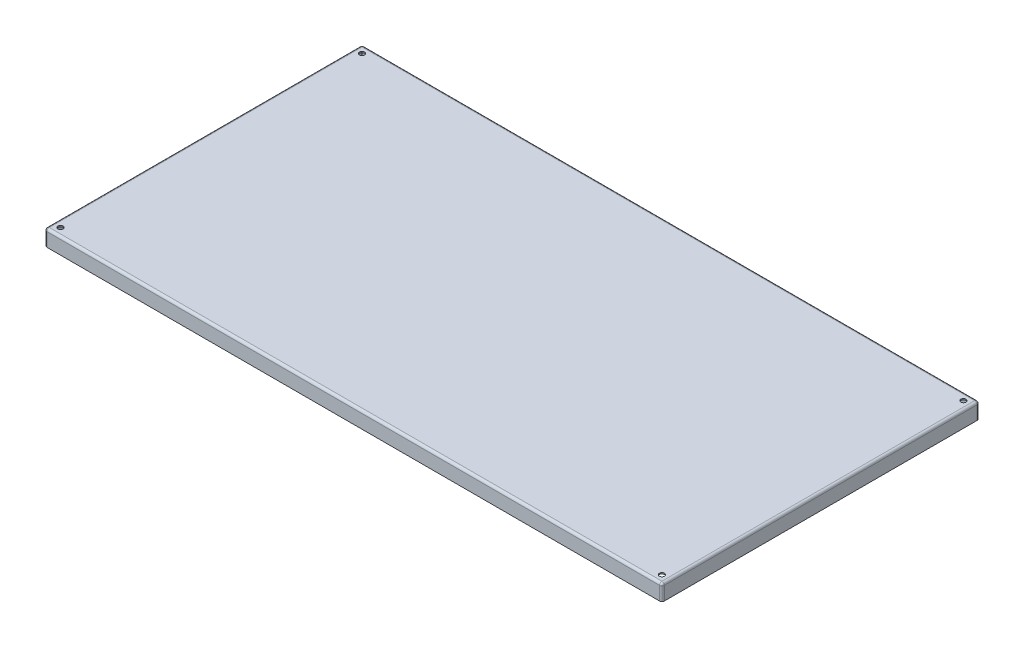
ISO-10303-21;
HEADER;
FILE_DESCRIPTION(('STEP AP214'),'2;1');
FILE_NAME('part.step','',(''),(''),'','','');
FILE_SCHEMA(('AUTOMOTIVE_DESIGN { 1 0 10303 214 1 1 1 1 }'));
ENDSEC;
DATA;
#1=APPLICATION_CONTEXT('core data for automotive mechanical design processes');
#2=APPLICATION_PROTOCOL_DEFINITION('international standard','automotive_design',2000,#1);
#3=PRODUCT_CONTEXT('',#1,'mechanical');
#4=PRODUCT('Part','Part','',(#3));
#5=PRODUCT_RELATED_PRODUCT_CATEGORY('part','',(#4));
#6=PRODUCT_DEFINITION_FORMATION('','',#4);
#7=PRODUCT_DEFINITION_CONTEXT('part definition',#1,'design');
#8=PRODUCT_DEFINITION('design','',#6,#7);
#9=PRODUCT_DEFINITION_SHAPE('','',#8);
#10=(LENGTH_UNIT() NAMED_UNIT(*) SI_UNIT(.MILLI.,.METRE.));
#11=(NAMED_UNIT(*) PLANE_ANGLE_UNIT() SI_UNIT($,.RADIAN.));
#12=(NAMED_UNIT(*) SI_UNIT($,.STERADIAN.) SOLID_ANGLE_UNIT());
#13=UNCERTAINTY_MEASURE_WITH_UNIT(LENGTH_MEASURE(1.E-05),#10,'distance_accuracy_value','');
#14=(GEOMETRIC_REPRESENTATION_CONTEXT(3) GLOBAL_UNCERTAINTY_ASSIGNED_CONTEXT((#13)) GLOBAL_UNIT_ASSIGNED_CONTEXT((#10,
#11,#12)) REPRESENTATION_CONTEXT('',''));
#15=CARTESIAN_POINT('',(0.,0.,0.));
#16=DIRECTION('',(0.,0.,1.));
#17=DIRECTION('',(1.,0.,0.));
#18=AXIS2_PLACEMENT_3D('',#15,#16,#17);
#19=CARTESIAN_POINT('',(-383.,46.072,-195.5));
#20=DIRECTION('',(0.,-1.,0.));
#21=DIRECTION('',(0.,0.,-1.));
#22=AXIS2_PLACEMENT_3D('',#19,#20,#21);
#23=CYLINDRICAL_SURFACE('',#22,3.);
#24=CARTESIAN_POINT('',(-383.,0.,-195.5));
#25=DIRECTION('',(0.,-1.,0.));
#26=DIRECTION('',(0.,0.,-1.));
#27=AXIS2_PLACEMENT_3D('',#24,#25,#26);
#28=CIRCLE('',#27,3.);
#29=CARTESIAN_POINT('',(-383.,0.,-198.5));
#30=VERTEX_POINT('',#29);
#31=CARTESIAN_POINT('',(-386.,0.,-195.5));
#32=VERTEX_POINT('',#31);
#33=EDGE_CURVE('E249',#30,#32,#28,.F.);
#34=ORIENTED_EDGE('',*,*,#33,.T.);
#35=DIRECTION('',(0.,1.,0.));
#36=VECTOR('',#35,1.);
#37=CARTESIAN_POINT('',(-386.,0.,-195.5));
#38=LINE('',#37,#36);
#39=CARTESIAN_POINT('',(-386.,17.0000000000545,-195.5));
#40=VERTEX_POINT('',#39);
#41=EDGE_CURVE('E177',#40,#32,#38,.F.);
#42=ORIENTED_EDGE('',*,*,#41,.F.);
#43=CARTESIAN_POINT('',(-383.,17.,-195.5));
#44=DIRECTION('',(-3.63229257265556E-11,-1.,3.6328196260101E-11));
#45=DIRECTION('',(-0.707106781186626,5.13721010175757E-11,0.707106781186469));
#46=AXIS2_PLACEMENT_3D('',#43,#44,#45);
#47=CIRCLE('',#46,3.00000000000004);
#48=CARTESIAN_POINT('',(-385.12132034356,17.,-197.62132034356));
#49=VERTEX_POINT('',#48);
#50=EDGE_CURVE('E306',#49,#40,#47,.F.);
#51=ORIENTED_EDGE('',*,*,#50,.F.);
#52=CARTESIAN_POINT('',(-383.,17.,-195.5));
#53=DIRECTION('',(-7.26595754978699E-11,-1.,0.));
#54=DIRECTION('',(-0.707106781186626,5.13721010175753E-11,0.707106781186469));
#55=AXIS2_PLACEMENT_3D('',#52,#53,#54);
#56=CIRCLE('',#55,3.00000000000004);
#57=CARTESIAN_POINT('',(-383.,17.,-198.5));
#58=VERTEX_POINT('',#57);
#59=EDGE_CURVE('E304',#58,#49,#56,.F.);
#60=ORIENTED_EDGE('',*,*,#59,.F.);
#61=DIRECTION('',(0.,1.,0.));
#62=VECTOR('',#61,1.);
#63=CARTESIAN_POINT('',(-383.,0.,-198.5));
#64=LINE('',#63,#62);
#65=EDGE_CURVE('E180',#30,#58,#64,.T.);
#66=ORIENTED_EDGE('',*,*,#65,.F.);
#67=EDGE_LOOP('',(#34,#42,#51,#60,#66));
#68=FACE_BOUND('',#67,.T.);
#69=ADVANCED_FACE('F17',(#68),#23,.T.);
#70=CARTESIAN_POINT('',(-383.,46.072,195.5));
#71=DIRECTION('',(0.,-1.,0.));
#72=DIRECTION('',(0.,0.,-1.));
#73=AXIS2_PLACEMENT_3D('',#70,#71,#72);
#74=CYLINDRICAL_SURFACE('',#73,3.);
#75=DIRECTION('',(0.,1.,0.));
#76=VECTOR('',#75,1.);
#77=CARTESIAN_POINT('',(-386.,0.,195.5));
#78=LINE('',#77,#76);
#79=CARTESIAN_POINT('',(-386.,0.,195.5));
#80=VERTEX_POINT('',#79);
#81=CARTESIAN_POINT('',(-386.,17.0000000000272,195.500000000027));
#82=VERTEX_POINT('',#81);
#83=EDGE_CURVE('E162',#80,#82,#78,.T.);
#84=ORIENTED_EDGE('',*,*,#83,.F.);
#85=CARTESIAN_POINT('',(-383.,0.,195.5));
#86=DIRECTION('',(0.,-1.,0.));
#87=DIRECTION('',(0.,0.,-1.));
#88=AXIS2_PLACEMENT_3D('',#85,#86,#87);
#89=CIRCLE('',#88,3.);
#90=CARTESIAN_POINT('',(-383.,0.,198.5));
#91=VERTEX_POINT('',#90);
#92=EDGE_CURVE('E20',#80,#91,#89,.F.);
#93=ORIENTED_EDGE('',*,*,#92,.T.);
#94=DIRECTION('',(0.,1.,0.));
#95=VECTOR('',#94,1.);
#96=CARTESIAN_POINT('',(-383.,0.,198.5));
#97=LINE('',#96,#95);
#98=CARTESIAN_POINT('',(-383.,17.,198.5));
#99=VERTEX_POINT('',#98);
#100=EDGE_CURVE('E150',#99,#91,#97,.F.);
#101=ORIENTED_EDGE('',*,*,#100,.F.);
#102=CARTESIAN_POINT('',(-383.,17.,195.5));
#103=DIRECTION('',(0.,-1.,0.));
#104=DIRECTION('',(0.,0.,-1.));
#105=AXIS2_PLACEMENT_3D('',#102,#103,#104);
#106=CIRCLE('',#105,3.);
#107=EDGE_CURVE('E158',#82,#99,#106,.F.);
#108=ORIENTED_EDGE('',*,*,#107,.F.);
#109=EDGE_LOOP('',(#84,#93,#101,#108));
#110=FACE_BOUND('',#109,.T.);
#111=ADVANCED_FACE('F161',(#110),#74,.T.);
#112=CARTESIAN_POINT('',(383.,46.072,195.5));
#113=DIRECTION('',(0.,-1.,0.));
#114=DIRECTION('',(0.,0.,-1.));
#115=AXIS2_PLACEMENT_3D('',#112,#113,#114);
#116=CYLINDRICAL_SURFACE('',#115,3.);
#117=DIRECTION('',(0.,1.,0.));
#118=VECTOR('',#117,1.);
#119=CARTESIAN_POINT('',(383.,0.,198.5));
#120=LINE('',#119,#118);
#121=CARTESIAN_POINT('',(383.,0.,198.5));
#122=VERTEX_POINT('',#121);
#123=CARTESIAN_POINT('',(383.,17.,198.5));
#124=VERTEX_POINT('',#123);
#125=EDGE_CURVE('E167',#122,#124,#120,.T.);
#126=ORIENTED_EDGE('',*,*,#125,.F.);
#127=CARTESIAN_POINT('',(383.,0.,195.5));
#128=DIRECTION('',(0.,-1.,0.));
#129=DIRECTION('',(0.,0.,-1.));
#130=AXIS2_PLACEMENT_3D('',#127,#128,#129);
#131=CIRCLE('',#130,3.);
#132=CARTESIAN_POINT('',(386.,0.,195.5));
#133=VERTEX_POINT('',#132);
#134=EDGE_CURVE('E163',#122,#133,#131,.F.);
#135=ORIENTED_EDGE('',*,*,#134,.T.);
#136=DIRECTION('',(0.,1.,0.));
#137=VECTOR('',#136,1.);
#138=CARTESIAN_POINT('',(386.,0.,195.5));
#139=LINE('',#138,#137);
#140=CARTESIAN_POINT('',(386.,17.,195.5));
#141=VERTEX_POINT('',#140);
#142=EDGE_CURVE('E247',#141,#133,#139,.F.);
#143=ORIENTED_EDGE('',*,*,#142,.F.);
#144=CARTESIAN_POINT('',(383.,17.,195.5));
#145=DIRECTION('',(0.,-1.,0.));
#146=DIRECTION('',(0.,0.,-1.));
#147=AXIS2_PLACEMENT_3D('',#144,#145,#146);
#148=CIRCLE('',#147,3.);
#149=EDGE_CURVE('E169',#124,#141,#148,.F.);
#150=ORIENTED_EDGE('',*,*,#149,.F.);
#151=EDGE_LOOP('',(#126,#135,#143,#150));
#152=FACE_BOUND('',#151,.T.);
#153=ADVANCED_FACE('F256',(#152),#116,.T.);
#154=CARTESIAN_POINT('',(383.,46.072,-195.5));
#155=DIRECTION('',(0.,-1.,0.));
#156=DIRECTION('',(0.,0.,-1.));
#157=AXIS2_PLACEMENT_3D('',#154,#155,#156);
#158=CYLINDRICAL_SURFACE('',#157,3.);
#159=DIRECTION('',(0.,1.,0.));
#160=VECTOR('',#159,1.);
#161=CARTESIAN_POINT('',(386.,0.,-195.5));
#162=LINE('',#161,#160);
#163=CARTESIAN_POINT('',(386.,0.,-195.5));
#164=VERTEX_POINT('',#163);
#165=CARTESIAN_POINT('',(386.,17.,-195.5));
#166=VERTEX_POINT('',#165);
#167=EDGE_CURVE('E263',#164,#166,#162,.T.);
#168=ORIENTED_EDGE('',*,*,#167,.F.);
#169=CARTESIAN_POINT('',(383.,0.,-195.5));
#170=DIRECTION('',(0.,-1.,0.));
#171=DIRECTION('',(0.,0.,-1.));
#172=AXIS2_PLACEMENT_3D('',#169,#170,#171);
#173=CIRCLE('',#172,3.);
#174=CARTESIAN_POINT('',(383.,0.,-198.5));
#175=VERTEX_POINT('',#174);
#176=EDGE_CURVE('E252',#164,#175,#173,.F.);
#177=ORIENTED_EDGE('',*,*,#176,.T.);
#178=DIRECTION('',(0.,1.,0.));
#179=VECTOR('',#178,1.);
#180=CARTESIAN_POINT('',(383.,0.,-198.5));
#181=LINE('',#180,#179);
#182=CARTESIAN_POINT('',(383.,17.0000000006364,-198.5));
#183=VERTEX_POINT('',#182);
#184=EDGE_CURVE('E181',#183,#175,#181,.F.);
#185=ORIENTED_EDGE('',*,*,#184,.F.);
#186=CARTESIAN_POINT('',(383.,17.,-195.5));
#187=DIRECTION('',(0.,-1.,-8.48502434980247E-10));
#188=DIRECTION('',(-1.,0.,0.));
#189=AXIS2_PLACEMENT_3D('',#186,#187,#188);
#190=CIRCLE('',#189,3.);
#191=EDGE_CURVE('E264',#166,#183,#190,.F.);
#192=ORIENTED_EDGE('',*,*,#191,.F.);
#193=EDGE_LOOP('',(#168,#177,#185,#192));
#194=FACE_BOUND('',#193,.T.);
#195=ADVANCED_FACE('F557',(#194),#158,.T.);
#196=CARTESIAN_POINT('',(0.,0.,0.));
#197=DIRECTION('',(0.,1.,0.));
#198=DIRECTION('',(0.,0.,1.));
#199=AXIS2_PLACEMENT_3D('',#196,#197,#198);
#200=PLANE('',#199);
#201=DIRECTION('',(-1.,0.,0.));
#202=VECTOR('',#201,1.);
#203=CARTESIAN_POINT('',(-366.,0.,178.5));
#204=LINE('',#203,#202);
#205=CARTESIAN_POINT('',(366.,0.,178.5));
#206=VERTEX_POINT('',#205);
#207=CARTESIAN_POINT('',(-366.,0.,178.5));
#208=VERTEX_POINT('',#207);
#209=EDGE_CURVE('E362',#206,#208,#204,.T.);
#210=ORIENTED_EDGE('',*,*,#209,.F.);
#211=DIRECTION('',(0.,0.,1.));
#212=VECTOR('',#211,1.);
#213=CARTESIAN_POINT('',(366.,0.,178.5));
#214=LINE('',#213,#212);
#215=CARTESIAN_POINT('',(366.,0.,-178.5));
#216=VERTEX_POINT('',#215);
#217=EDGE_CURVE('E245',#216,#206,#214,.T.);
#218=ORIENTED_EDGE('',*,*,#217,.F.);
#219=DIRECTION('',(1.,0.,0.));
#220=VECTOR('',#219,1.);
#221=CARTESIAN_POINT('',(366.,0.,-178.5));
#222=LINE('',#221,#220);
#223=CARTESIAN_POINT('',(-366.,0.,-178.5));
#224=VERTEX_POINT('',#223);
#225=EDGE_CURVE('E333',#224,#216,#222,.T.);
#226=ORIENTED_EDGE('',*,*,#225,.F.);
#227=DIRECTION('',(0.,0.,-1.));
#228=VECTOR('',#227,1.);
#229=CARTESIAN_POINT('',(-366.,0.,-178.5));
#230=LINE('',#229,#228);
#231=EDGE_CURVE('E367',#208,#224,#230,.T.);
#232=ORIENTED_EDGE('',*,*,#231,.F.);
#233=EDGE_LOOP('',(#210,#218,#226,#232));
#234=FACE_BOUND('',#233,.T.);
#235=CARTESIAN_POINT('',(376.,0.,-188.5));
#236=DIRECTION('',(0.,-1.,0.));
#237=DIRECTION('',(0.,0.,-1.));
#238=AXIS2_PLACEMENT_3D('',#235,#236,#237);
#239=CIRCLE('',#238,3.25);
#240=CARTESIAN_POINT('',(376.,0.,-191.75));
#241=VERTEX_POINT('',#240);
#242=EDGE_CURVE('E232',#241,#241,#239,.F.);
#243=ORIENTED_EDGE('',*,*,#242,.T.);
#244=EDGE_LOOP('',(#243));
#245=FACE_BOUND('',#244,.T.);
#246=CARTESIAN_POINT('',(-376.,0.,-188.5));
#247=DIRECTION('',(0.,-1.,0.));
#248=DIRECTION('',(0.,0.,-1.));
#249=AXIS2_PLACEMENT_3D('',#246,#247,#248);
#250=CIRCLE('',#249,3.25);
#251=CARTESIAN_POINT('',(-376.,0.,-191.75));
#252=VERTEX_POINT('',#251);
#253=EDGE_CURVE('E236',#252,#252,#250,.F.);
#254=ORIENTED_EDGE('',*,*,#253,.T.);
#255=EDGE_LOOP('',(#254));
#256=FACE_BOUND('',#255,.T.);
#257=CARTESIAN_POINT('',(376.,0.,188.5));
#258=DIRECTION('',(0.,-1.,0.));
#259=DIRECTION('',(0.,0.,-1.));
#260=AXIS2_PLACEMENT_3D('',#257,#258,#259);
#261=CIRCLE('',#260,3.25);
#262=CARTESIAN_POINT('',(376.,0.,185.25));
#263=VERTEX_POINT('',#262);
#264=EDGE_CURVE('E239',#263,#263,#261,.F.);
#265=ORIENTED_EDGE('',*,*,#264,.T.);
#266=EDGE_LOOP('',(#265));
#267=FACE_BOUND('',#266,.T.);
#268=CARTESIAN_POINT('',(-376.,0.,188.5));
#269=DIRECTION('',(0.,-1.,0.));
#270=DIRECTION('',(0.,0.,-1.));
#271=AXIS2_PLACEMENT_3D('',#268,#269,#270);
#272=CIRCLE('',#271,3.25);
#273=CARTESIAN_POINT('',(-376.,0.,185.25));
#274=VERTEX_POINT('',#273);
#275=EDGE_CURVE('E242',#274,#274,#272,.F.);
#276=ORIENTED_EDGE('',*,*,#275,.T.);
#277=EDGE_LOOP('',(#276));
#278=FACE_BOUND('',#277,.T.);
#279=ORIENTED_EDGE('',*,*,#33,.F.);
#280=DIRECTION('',(-1.,0.,0.));
#281=VECTOR('',#280,1.);
#282=CARTESIAN_POINT('',(386.,0.,-198.5));
#283=LINE('',#282,#281);
#284=EDGE_CURVE('E178',#175,#30,#283,.T.);
#285=ORIENTED_EDGE('',*,*,#284,.F.);
#286=ORIENTED_EDGE('',*,*,#176,.F.);
#287=DIRECTION('',(0.,0.,-1.));
#288=VECTOR('',#287,1.);
#289=CARTESIAN_POINT('',(386.,0.,198.5));
#290=LINE('',#289,#288);
#291=EDGE_CURVE('E173',#133,#164,#290,.T.);
#292=ORIENTED_EDGE('',*,*,#291,.F.);
#293=ORIENTED_EDGE('',*,*,#134,.F.);
#294=DIRECTION('',(1.,0.,0.));
#295=VECTOR('',#294,1.);
#296=CARTESIAN_POINT('',(-386.,0.,198.5));
#297=LINE('',#296,#295);
#298=EDGE_CURVE('E152',#91,#122,#297,.T.);
#299=ORIENTED_EDGE('',*,*,#298,.F.);
#300=ORIENTED_EDGE('',*,*,#92,.F.);
#301=DIRECTION('',(0.,0.,1.));
#302=VECTOR('',#301,1.);
#303=CARTESIAN_POINT('',(-386.,0.,-198.5));
#304=LINE('',#303,#302);
#305=EDGE_CURVE('E175',#32,#80,#304,.T.);
#306=ORIENTED_EDGE('',*,*,#305,.F.);
#307=EDGE_LOOP('',(#279,#285,#286,#292,#293,#299,#300,#306));
#308=FACE_BOUND('',#307,.T.);
#309=ADVANCED_FACE('F164',(#234,#245,#256,#267,#278,#308),#200,.F.);
#310=CARTESIAN_POINT('',(386.,0.,-198.5));
#311=DIRECTION('',(0.,0.,-1.));
#312=DIRECTION('',(-1.,0.,0.));
#313=AXIS2_PLACEMENT_3D('',#310,#311,#312);
#314=PLANE('',#313);
#315=ORIENTED_EDGE('',*,*,#284,.T.);
#316=ORIENTED_EDGE('',*,*,#65,.T.);
#317=DIRECTION('',(-1.,0.,0.));
#318=VECTOR('',#317,1.);
#319=CARTESIAN_POINT('',(1392.3792,17.,-198.5));
#320=LINE('',#319,#318);
#321=EDGE_CURVE('E231',#183,#58,#320,.T.);
#322=ORIENTED_EDGE('',*,*,#321,.F.);
#323=ORIENTED_EDGE('',*,*,#184,.T.);
#324=EDGE_LOOP('',(#315,#316,#322,#323));
#325=FACE_BOUND('',#324,.T.);
#326=ADVANCED_FACE('F299',(#325),#314,.T.);
#327=CARTESIAN_POINT('',(-383.,17.,-195.5));
#328=DIRECTION('',(-0.707106781186631,5.1372101017576E-11,0.707106781186464));
#329=DIRECTION('',(0.707106781186464,1.13539329529386E-13,0.707106781186631));
#330=AXIS2_PLACEMENT_3D('',#327,#328,#329);
#331=SPHERICAL_SURFACE('',#330,3.00000000000004);
#332=CARTESIAN_POINT('',(-383.,17.,-195.5));
#333=DIRECTION('',(-1.,0.,0.));
#334=DIRECTION('',(0.,0.,1.));
#335=AXIS2_PLACEMENT_3D('',#332,#333,#334);
#336=CIRCLE('',#335,3.);
#337=CARTESIAN_POINT('',(-383.,20.,-195.5));
#338=VERTEX_POINT('',#337);
#339=EDGE_CURVE('E229',#58,#338,#336,.F.);
#340=ORIENTED_EDGE('',*,*,#339,.F.);
#341=ORIENTED_EDGE('',*,*,#59,.T.);
#342=ORIENTED_EDGE('',*,*,#50,.T.);
#343=CARTESIAN_POINT('',(-383.,17.,-195.5));
#344=DIRECTION('',(0.,0.,1.));
#345=DIRECTION('',(1.,0.,0.));
#346=AXIS2_PLACEMENT_3D('',#343,#344,#345);
#347=CIRCLE('',#346,3.);
#348=EDGE_CURVE('E223',#338,#40,#347,.T.);
#349=ORIENTED_EDGE('',*,*,#348,.F.);
#350=EDGE_LOOP('',(#340,#341,#342,#349));
#351=FACE_BOUND('',#350,.T.);
#352=ADVANCED_FACE('F295',(#351),#331,.T.);
#353=CARTESIAN_POINT('',(-386.,0.,-198.5));
#354=DIRECTION('',(-1.,0.,0.));
#355=DIRECTION('',(0.,0.,1.));
#356=AXIS2_PLACEMENT_3D('',#353,#354,#355);
#357=PLANE('',#356);
#358=ORIENTED_EDGE('',*,*,#305,.T.);
#359=ORIENTED_EDGE('',*,*,#83,.T.);
#360=DIRECTION('',(0.,0.,1.));
#361=VECTOR('',#360,1.);
#362=CARTESIAN_POINT('',(-386.,17.0000000000545,-716.0292));
#363=LINE('',#362,#361);
#364=EDGE_CURVE('E226',#40,#82,#363,.T.);
#365=ORIENTED_EDGE('',*,*,#364,.F.);
#366=ORIENTED_EDGE('',*,*,#41,.T.);
#367=EDGE_LOOP('',(#358,#359,#365,#366));
#368=FACE_BOUND('',#367,.T.);
#369=ADVANCED_FACE('F290',(#368),#357,.T.);
#370=CARTESIAN_POINT('',(-383.,17.,195.5));
#371=DIRECTION('',(0.,0.707106781186547,-0.707106781186548));
#372=DIRECTION('',(0.,-0.707106781186548,-0.707106781186547));
#373=AXIS2_PLACEMENT_3D('',#370,#371,#372);
#374=SPHERICAL_SURFACE('',#373,2.99999999999999);
#375=CARTESIAN_POINT('',(-383.,17.,195.500000000055));
#376=DIRECTION('',(0.,0.,1.));
#377=DIRECTION('',(1.,0.,0.));
#378=AXIS2_PLACEMENT_3D('',#375,#376,#377);
#379=CIRCLE('',#378,3.);
#380=CARTESIAN_POINT('',(-383.,20.,195.500000000027));
#381=VERTEX_POINT('',#380);
#382=EDGE_CURVE('E227',#82,#381,#379,.F.);
#383=ORIENTED_EDGE('',*,*,#382,.F.);
#384=ORIENTED_EDGE('',*,*,#107,.T.);
#385=CARTESIAN_POINT('',(-383.,17.,195.5));
#386=DIRECTION('',(1.,0.,0.));
#387=DIRECTION('',(0.,0.,-1.));
#388=AXIS2_PLACEMENT_3D('',#385,#386,#387);
#389=CIRCLE('',#388,3.);
#390=EDGE_CURVE('E277',#381,#99,#389,.T.);
#391=ORIENTED_EDGE('',*,*,#390,.F.);
#392=EDGE_LOOP('',(#383,#384,#391));
#393=FACE_BOUND('',#392,.T.);
#394=ADVANCED_FACE('F286',(#393),#374,.T.);
#395=CARTESIAN_POINT('',(-386.,0.,198.5));
#396=DIRECTION('',(0.,0.,1.));
#397=DIRECTION('',(1.,0.,0.));
#398=AXIS2_PLACEMENT_3D('',#395,#396,#397);
#399=PLANE('',#398);
#400=ORIENTED_EDGE('',*,*,#298,.T.);
#401=ORIENTED_EDGE('',*,*,#125,.T.);
#402=DIRECTION('',(1.,0.,0.));
#403=VECTOR('',#402,1.);
#404=CARTESIAN_POINT('',(-1392.3792,17.,198.5));
#405=LINE('',#404,#403);
#406=EDGE_CURVE('E155',#99,#124,#405,.T.);
#407=ORIENTED_EDGE('',*,*,#406,.F.);
#408=ORIENTED_EDGE('',*,*,#100,.T.);
#409=EDGE_LOOP('',(#400,#401,#407,#408));
#410=FACE_BOUND('',#409,.T.);
#411=ADVANCED_FACE('F151',(#410),#399,.T.);
#412=CARTESIAN_POINT('',(383.,17.0000000000001,195.5));
#413=DIRECTION('',(0.707106781186562,-0.707106781186533,0.));
#414=DIRECTION('',(-0.707106781186533,-0.707106781186562,0.));
#415=AXIS2_PLACEMENT_3D('',#412,#413,#414);
#416=SPHERICAL_SURFACE('',#415,2.99999999999996);
#417=CARTESIAN_POINT('',(383.,17.,195.5));
#418=DIRECTION('',(1.,0.,0.));
#419=DIRECTION('',(0.,0.,-1.));
#420=AXIS2_PLACEMENT_3D('',#417,#418,#419);
#421=CIRCLE('',#420,3.);
#422=CARTESIAN_POINT('',(383.,20.,195.5));
#423=VERTEX_POINT('',#422);
#424=EDGE_CURVE('E220',#124,#423,#421,.F.);
#425=ORIENTED_EDGE('',*,*,#424,.F.);
#426=ORIENTED_EDGE('',*,*,#149,.T.);
#427=CARTESIAN_POINT('',(383.,17.,195.5));
#428=DIRECTION('',(0.,0.,-1.));
#429=DIRECTION('',(-1.,0.,0.));
#430=AXIS2_PLACEMENT_3D('',#427,#428,#429);
#431=CIRCLE('',#430,3.);
#432=EDGE_CURVE('E222',#423,#141,#431,.T.);
#433=ORIENTED_EDGE('',*,*,#432,.F.);
#434=EDGE_LOOP('',(#425,#426,#433));
#435=FACE_BOUND('',#434,.T.);
#436=ADVANCED_FACE('F387',(#435),#416,.T.);
#437=CARTESIAN_POINT('',(386.,0.,198.5));
#438=DIRECTION('',(1.,0.,0.));
#439=DIRECTION('',(0.,0.,-1.));
#440=AXIS2_PLACEMENT_3D('',#437,#438,#439);
#441=PLANE('',#440);
#442=ORIENTED_EDGE('',*,*,#167,.T.);
#443=DIRECTION('',(0.,0.,-1.));
#444=VECTOR('',#443,1.);
#445=CARTESIAN_POINT('',(386.,17.,716.0292));
#446=LINE('',#445,#444);
#447=EDGE_CURVE('E271',#141,#166,#446,.T.);
#448=ORIENTED_EDGE('',*,*,#447,.F.);
#449=ORIENTED_EDGE('',*,*,#142,.T.);
#450=ORIENTED_EDGE('',*,*,#291,.T.);
#451=EDGE_LOOP('',(#442,#448,#449,#450));
#452=FACE_BOUND('',#451,.T.);
#453=ADVANCED_FACE('F383',(#452),#441,.T.);
#454=CARTESIAN_POINT('',(383.,17.,-195.5));
#455=DIRECTION('',(-1.,0.,0.));
#456=DIRECTION('',(0.,-0.707106781186564,0.707106781186531));
#457=AXIS2_PLACEMENT_3D('',#454,#455,#456);
#458=SPHERICAL_SURFACE('',#457,3.);
#459=CARTESIAN_POINT('',(383.,17.,-195.5));
#460=DIRECTION('',(0.,0.,-1.));
#461=DIRECTION('',(-1.,0.,0.));
#462=AXIS2_PLACEMENT_3D('',#459,#460,#461);
#463=CIRCLE('',#462,3.);
#464=CARTESIAN_POINT('',(383.,20.,-195.5));
#465=VERTEX_POINT('',#464);
#466=EDGE_CURVE('E274',#166,#465,#463,.F.);
#467=ORIENTED_EDGE('',*,*,#466,.F.);
#468=ORIENTED_EDGE('',*,*,#191,.T.);
#469=CARTESIAN_POINT('',(383.,17.,-195.5));
#470=DIRECTION('',(-1.,0.,0.));
#471=DIRECTION('',(0.,0.,1.));
#472=AXIS2_PLACEMENT_3D('',#469,#470,#471);
#473=CIRCLE('',#472,3.);
#474=EDGE_CURVE('E235',#465,#183,#473,.T.);
#475=ORIENTED_EDGE('',*,*,#474,.F.);
#476=EDGE_LOOP('',(#467,#468,#475));
#477=FACE_BOUND('',#476,.T.);
#478=ADVANCED_FACE('F378',(#477),#458,.T.);
#479=CARTESIAN_POINT('',(366.,0.,-178.5));
#480=DIRECTION('',(0.,0.,1.));
#481=DIRECTION('',(1.,0.,0.));
#482=AXIS2_PLACEMENT_3D('',#479,#480,#481);
#483=PLANE('',#482);
#484=DIRECTION('',(0.,1.,0.));
#485=VECTOR('',#484,1.);
#486=CARTESIAN_POINT('',(-366.,0.,-178.5));
#487=LINE('',#486,#485);
#488=CARTESIAN_POINT('',(-366.,1.5,-178.5));
#489=VERTEX_POINT('',#488);
#490=EDGE_CURVE('E370',#224,#489,#487,.T.);
#491=ORIENTED_EDGE('',*,*,#490,.F.);
#492=ORIENTED_EDGE('',*,*,#225,.T.);
#493=DIRECTION('',(0.,1.,0.));
#494=VECTOR('',#493,1.);
#495=CARTESIAN_POINT('',(366.,0.,-178.5));
#496=LINE('',#495,#494);
#497=CARTESIAN_POINT('',(366.,1.5,-178.5));
#498=VERTEX_POINT('',#497);
#499=EDGE_CURVE('E357',#498,#216,#496,.F.);
#500=ORIENTED_EDGE('',*,*,#499,.F.);
#501=DIRECTION('',(1.,0.,0.));
#502=VECTOR('',#501,1.);
#503=CARTESIAN_POINT('',(0.,1.5,-178.5));
#504=LINE('',#503,#502);
#505=EDGE_CURVE('E337',#498,#489,#504,.F.);
#506=ORIENTED_EDGE('',*,*,#505,.T.);
#507=EDGE_LOOP('',(#491,#492,#500,#506));
#508=FACE_BOUND('',#507,.T.);
#509=ADVANCED_FACE('F382',(#508),#483,.T.);
#510=CARTESIAN_POINT('',(-366.,0.,-178.5));
#511=DIRECTION('',(1.,0.,0.));
#512=DIRECTION('',(0.,0.,-1.));
#513=AXIS2_PLACEMENT_3D('',#510,#511,#512);
#514=PLANE('',#513);
#515=DIRECTION('',(0.,1.,0.));
#516=VECTOR('',#515,1.);
#517=CARTESIAN_POINT('',(-366.,0.,178.5));
#518=LINE('',#517,#516);
#519=CARTESIAN_POINT('',(-366.,1.5,178.5));
#520=VERTEX_POINT('',#519);
#521=EDGE_CURVE('E365',#208,#520,#518,.T.);
#522=ORIENTED_EDGE('',*,*,#521,.F.);
#523=ORIENTED_EDGE('',*,*,#231,.T.);
#524=ORIENTED_EDGE('',*,*,#490,.T.);
#525=DIRECTION('',(0.,0.,-1.));
#526=VECTOR('',#525,1.);
#527=CARTESIAN_POINT('',(-366.,1.5,0.));
#528=LINE('',#527,#526);
#529=EDGE_CURVE('E345',#489,#520,#528,.F.);
#530=ORIENTED_EDGE('',*,*,#529,.T.);
#531=EDGE_LOOP('',(#522,#523,#524,#530));
#532=FACE_BOUND('',#531,.T.);
#533=ADVANCED_FACE('F480',(#532),#514,.T.);
#534=CARTESIAN_POINT('',(-366.,0.,178.5));
#535=DIRECTION('',(0.,0.,-1.));
#536=DIRECTION('',(-1.,0.,0.));
#537=AXIS2_PLACEMENT_3D('',#534,#535,#536);
#538=PLANE('',#537);
#539=DIRECTION('',(0.,1.,0.));
#540=VECTOR('',#539,1.);
#541=CARTESIAN_POINT('',(366.,0.,178.5));
#542=LINE('',#541,#540);
#543=CARTESIAN_POINT('',(366.,1.5,178.5));
#544=VERTEX_POINT('',#543);
#545=EDGE_CURVE('E360',#206,#544,#542,.T.);
#546=ORIENTED_EDGE('',*,*,#545,.F.);
#547=ORIENTED_EDGE('',*,*,#209,.T.);
#548=ORIENTED_EDGE('',*,*,#521,.T.);
#549=DIRECTION('',(1.,0.,0.));
#550=VECTOR('',#549,1.);
#551=CARTESIAN_POINT('',(0.,1.5,178.5));
#552=LINE('',#551,#550);
#553=EDGE_CURVE('E351',#520,#544,#552,.T.);
#554=ORIENTED_EDGE('',*,*,#553,.T.);
#555=EDGE_LOOP('',(#546,#547,#548,#554));
#556=FACE_BOUND('',#555,.T.);
#557=ADVANCED_FACE('F477',(#556),#538,.T.);
#558=CARTESIAN_POINT('',(366.,0.,178.5));
#559=DIRECTION('',(-1.,0.,0.));
#560=DIRECTION('',(0.,0.,1.));
#561=AXIS2_PLACEMENT_3D('',#558,#559,#560);
#562=PLANE('',#561);
#563=ORIENTED_EDGE('',*,*,#499,.T.);
#564=ORIENTED_EDGE('',*,*,#217,.T.);
#565=ORIENTED_EDGE('',*,*,#545,.T.);
#566=DIRECTION('',(0.,0.,-1.));
#567=VECTOR('',#566,1.);
#568=CARTESIAN_POINT('',(366.,1.5,0.));
#569=LINE('',#568,#567);
#570=EDGE_CURVE('E219',#544,#498,#569,.T.);
#571=ORIENTED_EDGE('',*,*,#570,.T.);
#572=EDGE_LOOP('',(#563,#564,#565,#571));
#573=FACE_BOUND('',#572,.T.);
#574=ADVANCED_FACE('F473',(#573),#562,.T.);
#575=CARTESIAN_POINT('',(-376.,0.,188.5));
#576=DIRECTION('',(0.,-1.,0.));
#577=DIRECTION('',(0.,0.,-1.));
#578=AXIS2_PLACEMENT_3D('',#575,#576,#577);
#579=CYLINDRICAL_SURFACE('',#578,3.25);
#580=ORIENTED_EDGE('',*,*,#275,.F.);
#581=EDGE_LOOP('',(#580));
#582=FACE_BOUND('',#581,.T.);
#583=CARTESIAN_POINT('',(-376.,1.5,188.5));
#584=DIRECTION('',(0.,-1.,0.));
#585=DIRECTION('',(0.,0.,-1.));
#586=AXIS2_PLACEMENT_3D('',#583,#584,#585);
#587=CIRCLE('',#586,3.25);
#588=CARTESIAN_POINT('',(-376.,1.5,185.25));
#589=VERTEX_POINT('',#588);
#590=EDGE_CURVE('E216',#589,#589,#587,.F.);
#591=ORIENTED_EDGE('',*,*,#590,.T.);
#592=EDGE_LOOP('',(#591));
#593=FACE_BOUND('',#592,.T.);
#594=ADVANCED_FACE('F469',(#582,#593),#579,.F.);
#595=CARTESIAN_POINT('',(376.,0.,188.5));
#596=DIRECTION('',(0.,-1.,0.));
#597=DIRECTION('',(0.,0.,-1.));
#598=AXIS2_PLACEMENT_3D('',#595,#596,#597);
#599=CYLINDRICAL_SURFACE('',#598,3.25);
#600=ORIENTED_EDGE('',*,*,#264,.F.);
#601=EDGE_LOOP('',(#600));
#602=FACE_BOUND('',#601,.T.);
#603=CARTESIAN_POINT('',(376.,1.5,188.5));
#604=DIRECTION('',(0.,-1.,0.));
#605=DIRECTION('',(0.,0.,-1.));
#606=AXIS2_PLACEMENT_3D('',#603,#604,#605);
#607=CIRCLE('',#606,3.25);
#608=CARTESIAN_POINT('',(376.,1.5,185.25));
#609=VERTEX_POINT('',#608);
#610=EDGE_CURVE('E213',#609,#609,#607,.F.);
#611=ORIENTED_EDGE('',*,*,#610,.T.);
#612=EDGE_LOOP('',(#611));
#613=FACE_BOUND('',#612,.T.);
#614=ADVANCED_FACE('F465',(#602,#613),#599,.F.);
#615=CARTESIAN_POINT('',(-376.,0.,-188.5));
#616=DIRECTION('',(0.,-1.,0.));
#617=DIRECTION('',(0.,0.,-1.));
#618=AXIS2_PLACEMENT_3D('',#615,#616,#617);
#619=CYLINDRICAL_SURFACE('',#618,3.25);
#620=ORIENTED_EDGE('',*,*,#253,.F.);
#621=EDGE_LOOP('',(#620));
#622=FACE_BOUND('',#621,.T.);
#623=CARTESIAN_POINT('',(-376.,1.5,-188.5));
#624=DIRECTION('',(0.,-1.,0.));
#625=DIRECTION('',(0.,0.,-1.));
#626=AXIS2_PLACEMENT_3D('',#623,#624,#625);
#627=CIRCLE('',#626,3.25);
#628=CARTESIAN_POINT('',(-376.,1.5,-191.75));
#629=VERTEX_POINT('',#628);
#630=EDGE_CURVE('E210',#629,#629,#627,.F.);
#631=ORIENTED_EDGE('',*,*,#630,.T.);
#632=EDGE_LOOP('',(#631));
#633=FACE_BOUND('',#632,.T.);
#634=ADVANCED_FACE('F461',(#622,#633),#619,.F.);
#635=CARTESIAN_POINT('',(376.,0.,-188.5));
#636=DIRECTION('',(0.,-1.,0.));
#637=DIRECTION('',(0.,0.,-1.));
#638=AXIS2_PLACEMENT_3D('',#635,#636,#637);
#639=CYLINDRICAL_SURFACE('',#638,3.25);
#640=ORIENTED_EDGE('',*,*,#242,.F.);
#641=EDGE_LOOP('',(#640));
#642=FACE_BOUND('',#641,.T.);
#643=CARTESIAN_POINT('',(376.,1.5,-188.5));
#644=DIRECTION('',(0.,-1.,0.));
#645=DIRECTION('',(0.,0.,-1.));
#646=AXIS2_PLACEMENT_3D('',#643,#644,#645);
#647=CIRCLE('',#646,3.25);
#648=CARTESIAN_POINT('',(376.,1.5,-191.75));
#649=VERTEX_POINT('',#648);
#650=EDGE_CURVE('E206',#649,#649,#647,.F.);
#651=ORIENTED_EDGE('',*,*,#650,.T.);
#652=EDGE_LOOP('',(#651));
#653=FACE_BOUND('',#652,.T.);
#654=ADVANCED_FACE('F457',(#642,#653),#639,.F.);
#655=CARTESIAN_POINT('',(1392.3792,17.,-195.5));
#656=DIRECTION('',(-1.,0.,0.));
#657=DIRECTION('',(0.,0.,1.));
#658=AXIS2_PLACEMENT_3D('',#655,#656,#657);
#659=CYLINDRICAL_SURFACE('',#658,3.);
#660=ORIENTED_EDGE('',*,*,#339,.T.);
#661=DIRECTION('',(1.,0.,0.));
#662=VECTOR('',#661,1.);
#663=CARTESIAN_POINT('',(0.,20.,-195.5));
#664=LINE('',#663,#662);
#665=EDGE_CURVE('E209',#465,#338,#664,.F.);
#666=ORIENTED_EDGE('',*,*,#665,.F.);
#667=ORIENTED_EDGE('',*,*,#474,.T.);
#668=ORIENTED_EDGE('',*,*,#321,.T.);
#669=EDGE_LOOP('',(#660,#666,#667,#668));
#670=FACE_BOUND('',#669,.T.);
#671=ADVANCED_FACE('F453',(#670),#659,.T.);
#672=CARTESIAN_POINT('',(-383.,17.,-716.0292));
#673=DIRECTION('',(0.,0.,1.));
#674=DIRECTION('',(1.,0.,0.));
#675=AXIS2_PLACEMENT_3D('',#672,#673,#674);
#676=CYLINDRICAL_SURFACE('',#675,3.);
#677=ORIENTED_EDGE('',*,*,#348,.T.);
#678=ORIENTED_EDGE('',*,*,#364,.T.);
#679=ORIENTED_EDGE('',*,*,#382,.T.);
#680=DIRECTION('',(0.,0.,1.));
#681=VECTOR('',#680,1.);
#682=CARTESIAN_POINT('',(-383.,20.,0.));
#683=LINE('',#682,#681);
#684=EDGE_CURVE('E283',#338,#381,#683,.T.);
#685=ORIENTED_EDGE('',*,*,#684,.F.);
#686=EDGE_LOOP('',(#677,#678,#679,#685));
#687=FACE_BOUND('',#686,.T.);
#688=ADVANCED_FACE('F449',(#687),#676,.T.);
#689=CARTESIAN_POINT('',(-1392.3792,17.,195.5));
#690=DIRECTION('',(1.,0.,0.));
#691=DIRECTION('',(0.,0.,-1.));
#692=AXIS2_PLACEMENT_3D('',#689,#690,#691);
#693=CYLINDRICAL_SURFACE('',#692,3.);
#694=ORIENTED_EDGE('',*,*,#406,.T.);
#695=ORIENTED_EDGE('',*,*,#424,.T.);
#696=DIRECTION('',(1.,0.,0.));
#697=VECTOR('',#696,1.);
#698=CARTESIAN_POINT('',(0.,20.,195.5));
#699=LINE('',#698,#697);
#700=EDGE_CURVE('E532',#381,#423,#699,.T.);
#701=ORIENTED_EDGE('',*,*,#700,.F.);
#702=ORIENTED_EDGE('',*,*,#390,.T.);
#703=EDGE_LOOP('',(#694,#695,#701,#702));
#704=FACE_BOUND('',#703,.T.);
#705=ADVANCED_FACE('F446',(#704),#693,.T.);
#706=CARTESIAN_POINT('',(383.,17.,716.0292));
#707=DIRECTION('',(0.,0.,-1.));
#708=DIRECTION('',(-1.,0.,0.));
#709=AXIS2_PLACEMENT_3D('',#706,#707,#708);
#710=CYLINDRICAL_SURFACE('',#709,3.);
#711=ORIENTED_EDGE('',*,*,#447,.T.);
#712=ORIENTED_EDGE('',*,*,#466,.T.);
#713=DIRECTION('',(0.,0.,1.));
#714=VECTOR('',#713,1.);
#715=CARTESIAN_POINT('',(383.,20.,0.));
#716=LINE('',#715,#714);
#717=EDGE_CURVE('E501',#423,#465,#716,.F.);
#718=ORIENTED_EDGE('',*,*,#717,.F.);
#719=ORIENTED_EDGE('',*,*,#432,.T.);
#720=EDGE_LOOP('',(#711,#712,#718,#719));
#721=FACE_BOUND('',#720,.T.);
#722=ADVANCED_FACE('F442',(#721),#710,.T.);
#723=CARTESIAN_POINT('',(0.,1.5,0.));
#724=DIRECTION('',(0.,-1.,0.));
#725=DIRECTION('',(0.,0.,-1.));
#726=AXIS2_PLACEMENT_3D('',#723,#724,#725);
#727=PLANE('',#726);
#728=ORIENTED_EDGE('',*,*,#650,.F.);
#729=EDGE_LOOP('',(#728));
#730=FACE_BOUND('',#729,.T.);
#731=ORIENTED_EDGE('',*,*,#630,.F.);
#732=EDGE_LOOP('',(#731));
#733=FACE_BOUND('',#732,.T.);
#734=ORIENTED_EDGE('',*,*,#610,.F.);
#735=EDGE_LOOP('',(#734));
#736=FACE_BOUND('',#735,.T.);
#737=ORIENTED_EDGE('',*,*,#590,.F.);
#738=EDGE_LOOP('',(#737));
#739=FACE_BOUND('',#738,.T.);
#740=ORIENTED_EDGE('',*,*,#553,.F.);
#741=ORIENTED_EDGE('',*,*,#529,.F.);
#742=ORIENTED_EDGE('',*,*,#505,.F.);
#743=ORIENTED_EDGE('',*,*,#570,.F.);
#744=EDGE_LOOP('',(#740,#741,#742,#743));
#745=FACE_BOUND('',#744,.T.);
#746=DIRECTION('',(0.,0.,1.));
#747=VECTOR('',#746,1.);
#748=CARTESIAN_POINT('',(-384.5,1.5,-198.5));
#749=LINE('',#748,#747);
#750=CARTESIAN_POINT('',(-384.5,1.5,-197.));
#751=VERTEX_POINT('',#750);
#752=CARTESIAN_POINT('',(-384.5,1.5,197.));
#753=VERTEX_POINT('',#752);
#754=EDGE_CURVE('E509',#751,#753,#749,.T.);
#755=ORIENTED_EDGE('',*,*,#754,.T.);
#756=DIRECTION('',(1.,0.,0.));
#757=VECTOR('',#756,1.);
#758=CARTESIAN_POINT('',(-386.,1.5,197.));
#759=LINE('',#758,#757);
#760=CARTESIAN_POINT('',(384.5,1.5,197.));
#761=VERTEX_POINT('',#760);
#762=EDGE_CURVE('E512',#753,#761,#759,.T.);
#763=ORIENTED_EDGE('',*,*,#762,.T.);
#764=DIRECTION('',(0.,0.,-1.));
#765=VECTOR('',#764,1.);
#766=CARTESIAN_POINT('',(384.5,1.5,198.5));
#767=LINE('',#766,#765);
#768=CARTESIAN_POINT('',(384.5,1.5,-197.));
#769=VERTEX_POINT('',#768);
#770=EDGE_CURVE('E498',#761,#769,#767,.T.);
#771=ORIENTED_EDGE('',*,*,#770,.T.);
#772=DIRECTION('',(-1.,0.,0.));
#773=VECTOR('',#772,1.);
#774=CARTESIAN_POINT('',(386.,1.5,-197.));
#775=LINE('',#774,#773);
#776=EDGE_CURVE('E504',#769,#751,#775,.T.);
#777=ORIENTED_EDGE('',*,*,#776,.T.);
#778=EDGE_LOOP('',(#755,#763,#771,#777));
#779=FACE_BOUND('',#778,.T.);
#780=ADVANCED_FACE('F438',(#730,#733,#736,#739,#745,#779),#727,.F.);
#781=CARTESIAN_POINT('',(0.,20.,0.));
#782=DIRECTION('',(0.,1.,0.));
#783=DIRECTION('',(0.,0.,1.));
#784=AXIS2_PLACEMENT_3D('',#781,#782,#783);
#785=PLANE('',#784);
#786=CARTESIAN_POINT('',(-376.,20.,188.5));
#787=DIRECTION('',(0.,-1.,0.));
#788=DIRECTION('',(0.,0.,-1.));
#789=AXIS2_PLACEMENT_3D('',#786,#787,#788);
#790=CIRCLE('',#789,3.25);
#791=CARTESIAN_POINT('',(-376.,20.,185.25));
#792=VERTEX_POINT('',#791);
#793=EDGE_CURVE('E202',#792,#792,#790,.T.);
#794=ORIENTED_EDGE('',*,*,#793,.T.);
#795=EDGE_LOOP('',(#794));
#796=FACE_BOUND('',#795,.T.);
#797=CARTESIAN_POINT('',(376.,20.,-188.5));
#798=DIRECTION('',(0.,-1.,0.));
#799=DIRECTION('',(0.,0.,-1.));
#800=AXIS2_PLACEMENT_3D('',#797,#798,#799);
#801=CIRCLE('',#800,3.25);
#802=CARTESIAN_POINT('',(376.,20.,-191.75));
#803=VERTEX_POINT('',#802);
#804=EDGE_CURVE('E192',#803,#803,#801,.T.);
#805=ORIENTED_EDGE('',*,*,#804,.T.);
#806=EDGE_LOOP('',(#805));
#807=FACE_BOUND('',#806,.T.);
#808=CARTESIAN_POINT('',(-376.,20.,-188.5));
#809=DIRECTION('',(0.,-1.,0.));
#810=DIRECTION('',(0.,0.,-1.));
#811=AXIS2_PLACEMENT_3D('',#808,#809,#810);
#812=CIRCLE('',#811,3.25);
#813=CARTESIAN_POINT('',(-376.,20.,-191.75));
#814=VERTEX_POINT('',#813);
#815=EDGE_CURVE('E196',#814,#814,#812,.T.);
#816=ORIENTED_EDGE('',*,*,#815,.T.);
#817=EDGE_LOOP('',(#816));
#818=FACE_BOUND('',#817,.T.);
#819=CARTESIAN_POINT('',(376.,20.,188.5));
#820=DIRECTION('',(0.,-1.,0.));
#821=DIRECTION('',(0.,0.,-1.));
#822=AXIS2_PLACEMENT_3D('',#819,#820,#821);
#823=CIRCLE('',#822,3.25);
#824=CARTESIAN_POINT('',(376.,20.,185.25));
#825=VERTEX_POINT('',#824);
#826=EDGE_CURVE('E199',#825,#825,#823,.T.);
#827=ORIENTED_EDGE('',*,*,#826,.T.);
#828=EDGE_LOOP('',(#827));
#829=FACE_BOUND('',#828,.T.);
#830=ORIENTED_EDGE('',*,*,#700,.T.);
#831=ORIENTED_EDGE('',*,*,#717,.T.);
#832=ORIENTED_EDGE('',*,*,#665,.T.);
#833=ORIENTED_EDGE('',*,*,#684,.T.);
#834=EDGE_LOOP('',(#830,#831,#832,#833));
#835=FACE_BOUND('',#834,.T.);
#836=ADVANCED_FACE('F434',(#796,#807,#818,#829,#835),#785,.T.);
#837=CARTESIAN_POINT('',(384.5,0.,198.5));
#838=DIRECTION('',(1.,0.,0.));
#839=DIRECTION('',(0.,0.,-1.));
#840=AXIS2_PLACEMENT_3D('',#837,#838,#839);
#841=PLANE('',#840);
#842=ORIENTED_EDGE('',*,*,#770,.F.);
#843=DIRECTION('',(0.,1.,0.));
#844=VECTOR('',#843,1.);
#845=CARTESIAN_POINT('',(384.5,0.,197.));
#846=LINE('',#845,#844);
#847=CARTESIAN_POINT('',(384.5,18.5,197.));
#848=VERTEX_POINT('',#847);
#849=EDGE_CURVE('E205',#761,#848,#846,.T.);
#850=ORIENTED_EDGE('',*,*,#849,.T.);
#851=DIRECTION('',(0.,0.,1.));
#852=VECTOR('',#851,1.);
#853=CARTESIAN_POINT('',(384.5,18.5,0.));
#854=LINE('',#853,#852);
#855=CARTESIAN_POINT('',(384.5,18.5,-197.));
#856=VERTEX_POINT('',#855);
#857=EDGE_CURVE('E195',#848,#856,#854,.F.);
#858=ORIENTED_EDGE('',*,*,#857,.T.);
#859=DIRECTION('',(0.,1.,0.));
#860=VECTOR('',#859,1.);
#861=CARTESIAN_POINT('',(384.5,0.,-197.));
#862=LINE('',#861,#860);
#863=EDGE_CURVE('E500',#856,#769,#862,.F.);
#864=ORIENTED_EDGE('',*,*,#863,.T.);
#865=EDGE_LOOP('',(#842,#850,#858,#864));
#866=FACE_BOUND('',#865,.T.);
#867=ADVANCED_FACE('F430',(#866),#841,.F.);
#868=CARTESIAN_POINT('',(386.,0.,-197.));
#869=DIRECTION('',(0.,0.,-1.));
#870=DIRECTION('',(-1.,0.,0.));
#871=AXIS2_PLACEMENT_3D('',#868,#869,#870);
#872=PLANE('',#871);
#873=ORIENTED_EDGE('',*,*,#776,.F.);
#874=ORIENTED_EDGE('',*,*,#863,.F.);
#875=DIRECTION('',(1.,0.,0.));
#876=VECTOR('',#875,1.);
#877=CARTESIAN_POINT('',(0.,18.5,-197.));
#878=LINE('',#877,#876);
#879=CARTESIAN_POINT('',(-384.5,18.5,-197.));
#880=VERTEX_POINT('',#879);
#881=EDGE_CURVE('E519',#856,#880,#878,.F.);
#882=ORIENTED_EDGE('',*,*,#881,.T.);
#883=DIRECTION('',(0.,1.,0.));
#884=VECTOR('',#883,1.);
#885=CARTESIAN_POINT('',(-384.5,0.,-197.));
#886=LINE('',#885,#884);
#887=EDGE_CURVE('E506',#880,#751,#886,.F.);
#888=ORIENTED_EDGE('',*,*,#887,.T.);
#889=EDGE_LOOP('',(#873,#874,#882,#888));
#890=FACE_BOUND('',#889,.T.);
#891=ADVANCED_FACE('F426',(#890),#872,.F.);
#892=CARTESIAN_POINT('',(-384.5,0.,-198.5));
#893=DIRECTION('',(-1.,0.,0.));
#894=DIRECTION('',(0.,0.,1.));
#895=AXIS2_PLACEMENT_3D('',#892,#893,#894);
#896=PLANE('',#895);
#897=ORIENTED_EDGE('',*,*,#754,.F.);
#898=ORIENTED_EDGE('',*,*,#887,.F.);
#899=DIRECTION('',(0.,0.,1.));
#900=VECTOR('',#899,1.);
#901=CARTESIAN_POINT('',(-384.5,18.5,0.));
#902=LINE('',#901,#900);
#903=CARTESIAN_POINT('',(-384.5,18.5,197.));
#904=VERTEX_POINT('',#903);
#905=EDGE_CURVE('E522',#880,#904,#902,.T.);
#906=ORIENTED_EDGE('',*,*,#905,.T.);
#907=DIRECTION('',(0.,1.,0.));
#908=VECTOR('',#907,1.);
#909=CARTESIAN_POINT('',(-384.5,0.,197.));
#910=LINE('',#909,#908);
#911=EDGE_CURVE('E35',#904,#753,#910,.F.);
#912=ORIENTED_EDGE('',*,*,#911,.T.);
#913=EDGE_LOOP('',(#897,#898,#906,#912));
#914=FACE_BOUND('',#913,.T.);
#915=ADVANCED_FACE('F423',(#914),#896,.F.);
#916=CARTESIAN_POINT('',(-386.,0.,197.));
#917=DIRECTION('',(0.,0.,1.));
#918=DIRECTION('',(1.,0.,0.));
#919=AXIS2_PLACEMENT_3D('',#916,#917,#918);
#920=PLANE('',#919);
#921=ORIENTED_EDGE('',*,*,#762,.F.);
#922=ORIENTED_EDGE('',*,*,#911,.F.);
#923=DIRECTION('',(1.,0.,0.));
#924=VECTOR('',#923,1.);
#925=CARTESIAN_POINT('',(0.,18.5,197.));
#926=LINE('',#925,#924);
#927=EDGE_CURVE('E191',#904,#848,#926,.T.);
#928=ORIENTED_EDGE('',*,*,#927,.T.);
#929=ORIENTED_EDGE('',*,*,#849,.F.);
#930=EDGE_LOOP('',(#921,#922,#928,#929));
#931=FACE_BOUND('',#930,.T.);
#932=ADVANCED_FACE('F419',(#931),#920,.F.);
#933=CARTESIAN_POINT('',(-376.,0.,188.5));
#934=DIRECTION('',(0.,-1.,0.));
#935=DIRECTION('',(0.,0.,-1.));
#936=AXIS2_PLACEMENT_3D('',#933,#934,#935);
#937=CYLINDRICAL_SURFACE('',#936,3.25);
#938=ORIENTED_EDGE('',*,*,#793,.F.);
#939=EDGE_LOOP('',(#938));
#940=FACE_BOUND('',#939,.T.);
#941=CARTESIAN_POINT('',(-376.,18.5,188.5));
#942=DIRECTION('',(0.,-1.,0.));
#943=DIRECTION('',(0.,0.,-1.));
#944=AXIS2_PLACEMENT_3D('',#941,#942,#943);
#945=CIRCLE('',#944,3.25);
#946=CARTESIAN_POINT('',(-376.,18.5,185.25));
#947=VERTEX_POINT('',#946);
#948=EDGE_CURVE('E188',#947,#947,#945,.T.);
#949=ORIENTED_EDGE('',*,*,#948,.T.);
#950=EDGE_LOOP('',(#949));
#951=FACE_BOUND('',#950,.T.);
#952=ADVANCED_FACE('F415',(#940,#951),#937,.F.);
#953=CARTESIAN_POINT('',(376.,0.,188.5));
#954=DIRECTION('',(0.,-1.,0.));
#955=DIRECTION('',(0.,0.,-1.));
#956=AXIS2_PLACEMENT_3D('',#953,#954,#955);
#957=CYLINDRICAL_SURFACE('',#956,3.25);
#958=ORIENTED_EDGE('',*,*,#826,.F.);
#959=EDGE_LOOP('',(#958));
#960=FACE_BOUND('',#959,.T.);
#961=CARTESIAN_POINT('',(376.,18.5,188.5));
#962=DIRECTION('',(0.,-1.,0.));
#963=DIRECTION('',(0.,0.,-1.));
#964=AXIS2_PLACEMENT_3D('',#961,#962,#963);
#965=CIRCLE('',#964,3.25);
#966=CARTESIAN_POINT('',(376.,18.5,185.25));
#967=VERTEX_POINT('',#966);
#968=EDGE_CURVE('E185',#967,#967,#965,.T.);
#969=ORIENTED_EDGE('',*,*,#968,.T.);
#970=EDGE_LOOP('',(#969));
#971=FACE_BOUND('',#970,.T.);
#972=ADVANCED_FACE('F411',(#960,#971),#957,.F.);
#973=CARTESIAN_POINT('',(-376.,0.,-188.5));
#974=DIRECTION('',(0.,-1.,0.));
#975=DIRECTION('',(0.,0.,-1.));
#976=AXIS2_PLACEMENT_3D('',#973,#974,#975);
#977=CYLINDRICAL_SURFACE('',#976,3.25);
#978=ORIENTED_EDGE('',*,*,#815,.F.);
#979=EDGE_LOOP('',(#978));
#980=FACE_BOUND('',#979,.T.);
#981=CARTESIAN_POINT('',(-376.,18.5,-188.5));
#982=DIRECTION('',(0.,-1.,0.));
#983=DIRECTION('',(0.,0.,-1.));
#984=AXIS2_PLACEMENT_3D('',#981,#982,#983);
#985=CIRCLE('',#984,3.25);
#986=CARTESIAN_POINT('',(-376.,18.5,-191.75));
#987=VERTEX_POINT('',#986);
#988=EDGE_CURVE('E26',#987,#987,#985,.T.);
#989=ORIENTED_EDGE('',*,*,#988,.T.);
#990=EDGE_LOOP('',(#989));
#991=FACE_BOUND('',#990,.T.);
#992=ADVANCED_FACE('F403',(#980,#991),#977,.F.);
#993=CARTESIAN_POINT('',(376.,0.,-188.5));
#994=DIRECTION('',(0.,-1.,0.));
#995=DIRECTION('',(0.,0.,-1.));
#996=AXIS2_PLACEMENT_3D('',#993,#994,#995);
#997=CYLINDRICAL_SURFACE('',#996,3.25);
#998=ORIENTED_EDGE('',*,*,#804,.F.);
#999=EDGE_LOOP('',(#998));
#1000=FACE_BOUND('',#999,.T.);
#1001=CARTESIAN_POINT('',(376.,18.5,-188.5));
#1002=DIRECTION('',(0.,-1.,0.));
#1003=DIRECTION('',(0.,0.,-1.));
#1004=AXIS2_PLACEMENT_3D('',#1001,#1002,#1003);
#1005=CIRCLE('',#1004,3.25);
#1006=CARTESIAN_POINT('',(376.,18.5,-191.75));
#1007=VERTEX_POINT('',#1006);
#1008=EDGE_CURVE('E11',#1007,#1007,#1005,.T.);
#1009=ORIENTED_EDGE('',*,*,#1008,.T.);
#1010=EDGE_LOOP('',(#1009));
#1011=FACE_BOUND('',#1010,.T.);
#1012=ADVANCED_FACE('F397',(#1000,#1011),#997,.F.);
#1013=CARTESIAN_POINT('',(0.,18.5,0.));
#1014=DIRECTION('',(0.,1.,0.));
#1015=DIRECTION('',(0.,0.,1.));
#1016=AXIS2_PLACEMENT_3D('',#1013,#1014,#1015);
#1017=PLANE('',#1016);
#1018=ORIENTED_EDGE('',*,*,#1008,.F.);
#1019=EDGE_LOOP('',(#1018));
#1020=FACE_BOUND('',#1019,.T.);
#1021=ORIENTED_EDGE('',*,*,#988,.F.);
#1022=EDGE_LOOP('',(#1021));
#1023=FACE_BOUND('',#1022,.T.);
#1024=ORIENTED_EDGE('',*,*,#968,.F.);
#1025=EDGE_LOOP('',(#1024));
#1026=FACE_BOUND('',#1025,.T.);
#1027=ORIENTED_EDGE('',*,*,#948,.F.);
#1028=EDGE_LOOP('',(#1027));
#1029=FACE_BOUND('',#1028,.T.);
#1030=ORIENTED_EDGE('',*,*,#905,.F.);
#1031=ORIENTED_EDGE('',*,*,#881,.F.);
#1032=ORIENTED_EDGE('',*,*,#857,.F.);
#1033=ORIENTED_EDGE('',*,*,#927,.F.);
#1034=EDGE_LOOP('',(#1030,#1031,#1032,#1033));
#1035=FACE_BOUND('',#1034,.T.);
#1036=ADVANCED_FACE('F395',(#1020,#1023,#1026,#1029,#1035),#1017,.F.);
#1037=CLOSED_SHELL('',(#69,#111,#153,#195,#309,#326,#352,#369,#394,#411,#436,#453,#478,#509,
#533,#557,#574,#594,#614,#634,#654,#671,#688,#705,#722,#780,#836,#867,#891,#915,#932,#952,#972,
#992,#1012,#1036));
#1038=MANIFOLD_SOLID_BREP('B1',#1037);
#1039=ADVANCED_BREP_SHAPE_REPRESENTATION('',(#18,#1038),#14);
#1040=SHAPE_DEFINITION_REPRESENTATION(#9,#1039);
ENDSEC;
END-ISO-10303-21;
